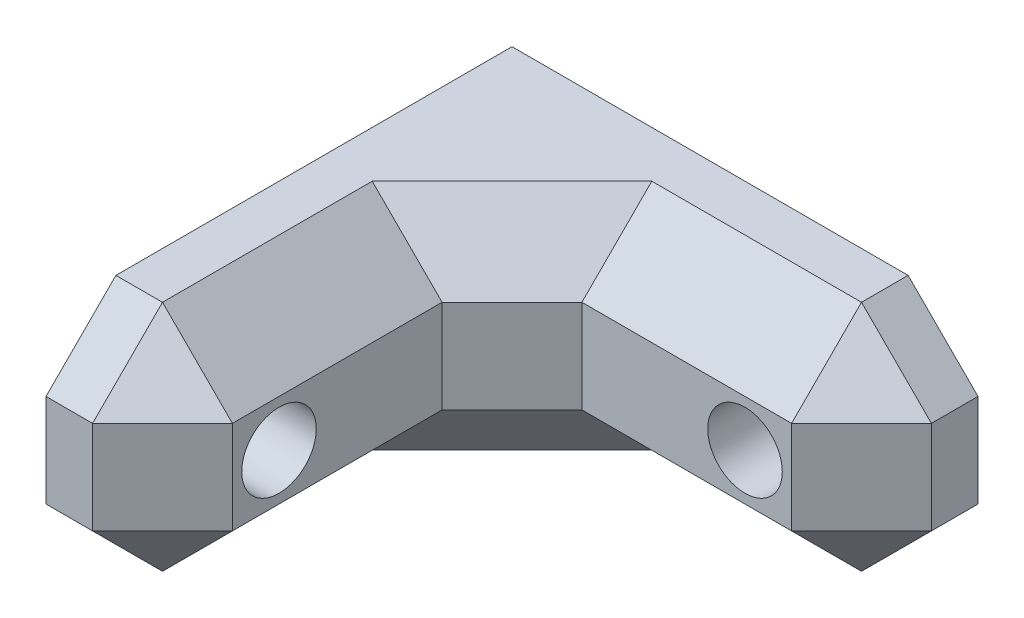
ISO-10303-21;
HEADER;
FILE_DESCRIPTION(('STEP AP214'),'2;1');
FILE_NAME('part.step','',(''),(''),'','','');
FILE_SCHEMA(('AUTOMOTIVE_DESIGN { 1 0 10303 214 1 1 1 1 }'));
ENDSEC;
DATA;
#1=APPLICATION_CONTEXT('core data for automotive mechanical design processes');
#2=APPLICATION_PROTOCOL_DEFINITION('international standard','automotive_design',2000,#1);
#3=PRODUCT_CONTEXT('',#1,'mechanical');
#4=PRODUCT('Part','Part','',(#3));
#5=PRODUCT_RELATED_PRODUCT_CATEGORY('part','',(#4));
#6=PRODUCT_DEFINITION_FORMATION('','',#4);
#7=PRODUCT_DEFINITION_CONTEXT('part definition',#1,'design');
#8=PRODUCT_DEFINITION('design','',#6,#7);
#9=PRODUCT_DEFINITION_SHAPE('','',#8);
#10=(LENGTH_UNIT() NAMED_UNIT(*) SI_UNIT(.MILLI.,.METRE.));
#11=(NAMED_UNIT(*) PLANE_ANGLE_UNIT() SI_UNIT($,.RADIAN.));
#12=(NAMED_UNIT(*) SI_UNIT($,.STERADIAN.) SOLID_ANGLE_UNIT());
#13=UNCERTAINTY_MEASURE_WITH_UNIT(LENGTH_MEASURE(1.E-05),#10,'distance_accuracy_value','');
#14=(GEOMETRIC_REPRESENTATION_CONTEXT(3) GLOBAL_UNCERTAINTY_ASSIGNED_CONTEXT((#13)) GLOBAL_UNIT_ASSIGNED_CONTEXT((#10,
#11,#12)) REPRESENTATION_CONTEXT('',''));
#15=CARTESIAN_POINT('',(0.,0.,0.));
#16=DIRECTION('',(0.,0.,1.));
#17=DIRECTION('',(1.,0.,0.));
#18=AXIS2_PLACEMENT_3D('',#15,#16,#17);
#19=CARTESIAN_POINT('',(0.,0.,5.));
#20=DIRECTION('',(0.,1.,0.));
#21=DIRECTION('',(0.,0.,1.));
#22=AXIS2_PLACEMENT_3D('',#19,#20,#21);
#23=PLANE('',#22);
#24=DIRECTION('',(1.,0.,0.));
#25=VECTOR('',#24,1.);
#26=CARTESIAN_POINT('',(0.,0.,0.));
#27=LINE('',#26,#25);
#28=CARTESIAN_POINT('',(0.,0.,0.));
#29=VERTEX_POINT('',#28);
#30=CARTESIAN_POINT('',(17.,0.,0.));
#31=VERTEX_POINT('',#30);
#32=EDGE_CURVE('E174',#29,#31,#27,.T.);
#33=ORIENTED_EDGE('',*,*,#32,.T.);
#34=DIRECTION('',(0.,0.,1.));
#35=VECTOR('',#34,1.);
#36=CARTESIAN_POINT('',(17.,0.,5.));
#37=LINE('',#36,#35);
#38=CARTESIAN_POINT('',(17.,0.,1.99999999999999));
#39=VERTEX_POINT('',#38);
#40=EDGE_CURVE('E253',#31,#39,#37,.T.);
#41=ORIENTED_EDGE('',*,*,#40,.T.);
#42=DIRECTION('',(-1.,0.,0.));
#43=VECTOR('',#42,1.);
#44=CARTESIAN_POINT('',(5.,0.,1.99999999999999));
#45=LINE('',#44,#43);
#46=CARTESIAN_POINT('',(8.,0.,1.99999999999999));
#47=VERTEX_POINT('',#46);
#48=EDGE_CURVE('E245',#39,#47,#45,.T.);
#49=ORIENTED_EDGE('',*,*,#48,.T.);
#50=DIRECTION('',(0.707106781186546,0.,-0.707106781186549));
#51=VECTOR('',#50,1.);
#52=CARTESIAN_POINT('',(8.,0.,1.99999999999999));
#53=LINE('',#52,#51);
#54=CARTESIAN_POINT('',(5.,0.,5.));
#55=VERTEX_POINT('',#54);
#56=EDGE_CURVE('E237',#55,#47,#53,.T.);
#57=ORIENTED_EDGE('',*,*,#56,.F.);
#58=DIRECTION('',(0.707106781186546,0.,-0.707106781186549));
#59=VECTOR('',#58,1.);
#60=CARTESIAN_POINT('',(8.,0.,1.99999999999999));
#61=LINE('',#60,#59);
#62=CARTESIAN_POINT('',(1.99999999999999,0.,8.00000000000001));
#63=VERTEX_POINT('',#62);
#64=EDGE_CURVE('E240',#63,#55,#61,.T.);
#65=ORIENTED_EDGE('',*,*,#64,.F.);
#66=DIRECTION('',(0.,0.,1.));
#67=VECTOR('',#66,1.);
#68=CARTESIAN_POINT('',(1.99999999999999,0.,20.));
#69=LINE('',#68,#67);
#70=CARTESIAN_POINT('',(1.99999999999999,0.,17.));
#71=VERTEX_POINT('',#70);
#72=EDGE_CURVE('E249',#63,#71,#69,.T.);
#73=ORIENTED_EDGE('',*,*,#72,.T.);
#74=DIRECTION('',(-1.,0.,0.));
#75=VECTOR('',#74,1.);
#76=CARTESIAN_POINT('',(0.,0.,17.));
#77=LINE('',#76,#75);
#78=CARTESIAN_POINT('',(0.,0.,17.));
#79=VERTEX_POINT('',#78);
#80=EDGE_CURVE('E251',#71,#79,#77,.T.);
#81=ORIENTED_EDGE('',*,*,#80,.T.);
#82=DIRECTION('',(0.,0.,-1.));
#83=VECTOR('',#82,1.);
#84=CARTESIAN_POINT('',(0.,0.,20.));
#85=LINE('',#84,#83);
#86=EDGE_CURVE('E159',#79,#29,#85,.T.);
#87=ORIENTED_EDGE('',*,*,#86,.T.);
#88=EDGE_LOOP('',(#33,#41,#49,#57,#65,#73,#81,#87));
#89=FACE_BOUND('',#88,.T.);
#90=ADVANCED_FACE('F35',(#89),#23,.F.);
#91=CARTESIAN_POINT('',(20.,0.,5.));
#92=DIRECTION('',(-1.,0.,0.));
#93=DIRECTION('',(0.,0.,1.));
#94=AXIS2_PLACEMENT_3D('',#91,#92,#93);
#95=PLANE('',#94);
#96=DIRECTION('',(0.,1.,0.));
#97=VECTOR('',#96,1.);
#98=CARTESIAN_POINT('',(20.,0.,0.));
#99=LINE('',#98,#97);
#100=CARTESIAN_POINT('',(20.,3.00000000000001,0.));
#101=VERTEX_POINT('',#100);
#102=CARTESIAN_POINT('',(20.,6.99999999999999,0.));
#103=VERTEX_POINT('',#102);
#104=EDGE_CURVE('E169',#101,#103,#99,.T.);
#105=ORIENTED_EDGE('',*,*,#104,.T.);
#106=DIRECTION('',(0.,0.,1.));
#107=VECTOR('',#106,1.);
#108=CARTESIAN_POINT('',(20.,6.99999999999999,5.));
#109=LINE('',#108,#107);
#110=CARTESIAN_POINT('',(20.,6.99999999999999,1.99999999999999));
#111=VERTEX_POINT('',#110);
#112=EDGE_CURVE('E235',#103,#111,#109,.T.);
#113=ORIENTED_EDGE('',*,*,#112,.T.);
#114=DIRECTION('',(0.,-1.,0.));
#115=VECTOR('',#114,1.);
#116=CARTESIAN_POINT('',(20.,0.,1.99999999999999));
#117=LINE('',#116,#115);
#118=CARTESIAN_POINT('',(20.,3.00000000000001,1.99999999999999));
#119=VERTEX_POINT('',#118);
#120=EDGE_CURVE('E231',#111,#119,#117,.T.);
#121=ORIENTED_EDGE('',*,*,#120,.T.);
#122=DIRECTION('',(0.,0.,-1.));
#123=VECTOR('',#122,1.);
#124=CARTESIAN_POINT('',(20.,3.00000000000001,5.));
#125=LINE('',#124,#123);
#126=EDGE_CURVE('E233',#119,#101,#125,.T.);
#127=ORIENTED_EDGE('',*,*,#126,.T.);
#128=EDGE_LOOP('',(#105,#113,#121,#127));
#129=FACE_BOUND('',#128,.T.);
#130=ADVANCED_FACE('F333',(#129),#95,.F.);
#131=CARTESIAN_POINT('',(0.,10.,5.));
#132=DIRECTION('',(0.,1.,0.));
#133=DIRECTION('',(0.,0.,1.));
#134=AXIS2_PLACEMENT_3D('',#131,#132,#133);
#135=PLANE('',#134);
#136=DIRECTION('',(0.,0.,-1.));
#137=VECTOR('',#136,1.);
#138=CARTESIAN_POINT('',(0.,10.,20.));
#139=LINE('',#138,#137);
#140=CARTESIAN_POINT('',(0.,10.,17.));
#141=VERTEX_POINT('',#140);
#142=CARTESIAN_POINT('',(0.,10.,0.));
#143=VERTEX_POINT('',#142);
#144=EDGE_CURVE('E148',#141,#143,#139,.T.);
#145=ORIENTED_EDGE('',*,*,#144,.F.);
#146=DIRECTION('',(1.,0.,0.));
#147=VECTOR('',#146,1.);
#148=CARTESIAN_POINT('',(0.,10.,17.));
#149=LINE('',#148,#147);
#150=CARTESIAN_POINT('',(2.,10.,17.));
#151=VERTEX_POINT('',#150);
#152=EDGE_CURVE('E225',#141,#151,#149,.T.);
#153=ORIENTED_EDGE('',*,*,#152,.T.);
#154=DIRECTION('',(0.,0.,-1.));
#155=VECTOR('',#154,1.);
#156=CARTESIAN_POINT('',(2.,10.,5.));
#157=LINE('',#156,#155);
#158=CARTESIAN_POINT('',(2.,10.,8.00000000000001));
#159=VERTEX_POINT('',#158);
#160=EDGE_CURVE('E221',#151,#159,#157,.T.);
#161=ORIENTED_EDGE('',*,*,#160,.T.);
#162=DIRECTION('',(-0.707106781186546,0.,0.707106781186549));
#163=VECTOR('',#162,1.);
#164=CARTESIAN_POINT('',(2.50000000000001,10.,7.5));
#165=LINE('',#164,#163);
#166=CARTESIAN_POINT('',(5.,10.,5.));
#167=VERTEX_POINT('',#166);
#168=EDGE_CURVE('E218',#167,#159,#165,.T.);
#169=ORIENTED_EDGE('',*,*,#168,.F.);
#170=DIRECTION('',(-0.707106781186546,0.,0.707106781186549));
#171=VECTOR('',#170,1.);
#172=CARTESIAN_POINT('',(2.50000000000001,10.,7.5));
#173=LINE('',#172,#171);
#174=CARTESIAN_POINT('',(8.,10.,1.99999999999999));
#175=VERTEX_POINT('',#174);
#176=EDGE_CURVE('E212',#175,#167,#173,.T.);
#177=ORIENTED_EDGE('',*,*,#176,.F.);
#178=DIRECTION('',(1.,0.,0.));
#179=VECTOR('',#178,1.);
#180=CARTESIAN_POINT('',(0.,10.,1.99999999999999));
#181=LINE('',#180,#179);
#182=CARTESIAN_POINT('',(17.,10.,1.99999999999999));
#183=VERTEX_POINT('',#182);
#184=EDGE_CURVE('E210',#175,#183,#181,.T.);
#185=ORIENTED_EDGE('',*,*,#184,.T.);
#186=DIRECTION('',(0.,0.,-1.));
#187=VECTOR('',#186,1.);
#188=CARTESIAN_POINT('',(17.,10.,0.));
#189=LINE('',#188,#187);
#190=CARTESIAN_POINT('',(17.,10.,0.));
#191=VERTEX_POINT('',#190);
#192=EDGE_CURVE('E166',#183,#191,#189,.T.);
#193=ORIENTED_EDGE('',*,*,#192,.T.);
#194=DIRECTION('',(1.,0.,0.));
#195=VECTOR('',#194,1.);
#196=CARTESIAN_POINT('',(0.,10.,0.));
#197=LINE('',#196,#195);
#198=EDGE_CURVE('E163',#143,#191,#197,.T.);
#199=ORIENTED_EDGE('',*,*,#198,.F.);
#200=EDGE_LOOP('',(#145,#153,#161,#169,#177,#185,#193,#199));
#201=FACE_BOUND('',#200,.T.);
#202=ADVANCED_FACE('F164',(#201),#135,.T.);
#203=CARTESIAN_POINT('',(15.,5.,5.));
#204=DIRECTION('',(0.,0.,-1.));
#205=DIRECTION('',(-1.,0.,0.));
#206=AXIS2_PLACEMENT_3D('',#203,#204,#205);
#207=CYLINDRICAL_SURFACE('',#206,1.6);
#208=CARTESIAN_POINT('',(15.,5.,5.));
#209=DIRECTION('',(0.,0.,1.));
#210=DIRECTION('',(1.,0.,0.));
#211=AXIS2_PLACEMENT_3D('',#208,#209,#210);
#212=CIRCLE('',#211,1.6);
#213=CARTESIAN_POINT('',(16.6,5.,5.));
#214=VERTEX_POINT('',#213);
#215=EDGE_CURVE('E168',#214,#214,#212,.T.);
#216=ORIENTED_EDGE('',*,*,#215,.T.);
#217=EDGE_LOOP('',(#216));
#218=FACE_BOUND('',#217,.T.);
#219=CARTESIAN_POINT('',(15.,5.,0.));
#220=DIRECTION('',(0.,0.,1.));
#221=DIRECTION('',(1.,0.,0.));
#222=AXIS2_PLACEMENT_3D('',#219,#220,#221);
#223=CIRCLE('',#222,1.6);
#224=CARTESIAN_POINT('',(16.6,5.,0.));
#225=VERTEX_POINT('',#224);
#226=EDGE_CURVE('E158',#225,#225,#223,.T.);
#227=ORIENTED_EDGE('',*,*,#226,.F.);
#228=EDGE_LOOP('',(#227));
#229=FACE_BOUND('',#228,.T.);
#230=ADVANCED_FACE('F343',(#218,#229),#207,.F.);
#231=CARTESIAN_POINT('',(0.,0.,5.));
#232=DIRECTION('',(0.,0.,1.));
#233=DIRECTION('',(1.,0.,0.));
#234=AXIS2_PLACEMENT_3D('',#231,#232,#233);
#235=PLANE('',#234);
#236=DIRECTION('',(-1.,0.,0.));
#237=VECTOR('',#236,1.);
#238=CARTESIAN_POINT('',(0.,7.00000000000001,5.));
#239=LINE('',#238,#237);
#240=CARTESIAN_POINT('',(17.,7.00000000000001,5.));
#241=VERTEX_POINT('',#240);
#242=CARTESIAN_POINT('',(8.,7.00000000000001,5.));
#243=VERTEX_POINT('',#242);
#244=EDGE_CURVE('E196',#241,#243,#239,.T.);
#245=ORIENTED_EDGE('',*,*,#244,.T.);
#246=DIRECTION('',(0.,-1.,0.));
#247=VECTOR('',#246,1.);
#248=CARTESIAN_POINT('',(8.,0.,5.));
#249=LINE('',#248,#247);
#250=CARTESIAN_POINT('',(8.,3.,5.));
#251=VERTEX_POINT('',#250);
#252=EDGE_CURVE('E198',#243,#251,#249,.T.);
#253=ORIENTED_EDGE('',*,*,#252,.T.);
#254=DIRECTION('',(1.,0.,0.));
#255=VECTOR('',#254,1.);
#256=CARTESIAN_POINT('',(20.,3.,5.));
#257=LINE('',#256,#255);
#258=CARTESIAN_POINT('',(17.,3.,5.));
#259=VERTEX_POINT('',#258);
#260=EDGE_CURVE('E194',#251,#259,#257,.T.);
#261=ORIENTED_EDGE('',*,*,#260,.T.);
#262=DIRECTION('',(0.,1.,0.));
#263=VECTOR('',#262,1.);
#264=CARTESIAN_POINT('',(17.,10.,5.));
#265=LINE('',#264,#263);
#266=EDGE_CURVE('E187',#259,#241,#265,.T.);
#267=ORIENTED_EDGE('',*,*,#266,.T.);
#268=EDGE_LOOP('',(#245,#253,#261,#267));
#269=FACE_BOUND('',#268,.T.);
#270=ORIENTED_EDGE('',*,*,#215,.F.);
#271=EDGE_LOOP('',(#270));
#272=FACE_BOUND('',#271,.T.);
#273=ADVANCED_FACE('F328',(#269,#272),#235,.T.);
#274=CARTESIAN_POINT('',(0.,0.,0.));
#275=DIRECTION('',(0.,0.,1.));
#276=DIRECTION('',(1.,0.,0.));
#277=AXIS2_PLACEMENT_3D('',#274,#275,#276);
#278=PLANE('',#277);
#279=ORIENTED_EDGE('',*,*,#226,.T.);
#280=EDGE_LOOP('',(#279));
#281=FACE_BOUND('',#280,.T.);
#282=ORIENTED_EDGE('',*,*,#198,.T.);
#283=DIRECTION('',(0.707106781186546,-0.707106781186549,0.));
#284=VECTOR('',#283,1.);
#285=CARTESIAN_POINT('',(17.,10.,0.));
#286=LINE('',#285,#284);
#287=EDGE_CURVE('E229',#191,#103,#286,.T.);
#288=ORIENTED_EDGE('',*,*,#287,.T.);
#289=ORIENTED_EDGE('',*,*,#104,.F.);
#290=DIRECTION('',(0.707106781186546,0.707106781186549,0.));
#291=VECTOR('',#290,1.);
#292=CARTESIAN_POINT('',(20.,3.00000000000001,0.));
#293=LINE('',#292,#291);
#294=EDGE_CURVE('E227',#101,#31,#293,.F.);
#295=ORIENTED_EDGE('',*,*,#294,.T.);
#296=ORIENTED_EDGE('',*,*,#32,.F.);
#297=DIRECTION('',(0.,1.,0.));
#298=VECTOR('',#297,1.);
#299=CARTESIAN_POINT('',(0.,0.,0.));
#300=LINE('',#299,#298);
#301=EDGE_CURVE('E153',#29,#143,#300,.T.);
#302=ORIENTED_EDGE('',*,*,#301,.T.);
#303=EDGE_LOOP('',(#282,#288,#289,#295,#296,#302));
#304=FACE_BOUND('',#303,.T.);
#305=ADVANCED_FACE('F172',(#281,#304),#278,.F.);
#306=CARTESIAN_POINT('',(5.,0.,20.));
#307=DIRECTION('',(1.,0.,0.));
#308=DIRECTION('',(0.,1.,0.));
#309=AXIS2_PLACEMENT_3D('',#306,#307,#308);
#310=PLANE('',#309);
#311=DIRECTION('',(0.,0.,-1.));
#312=VECTOR('',#311,1.);
#313=CARTESIAN_POINT('',(5.,3.,5.));
#314=LINE('',#313,#312);
#315=CARTESIAN_POINT('',(5.,3.,17.));
#316=VERTEX_POINT('',#315);
#317=CARTESIAN_POINT('',(5.,3.,8.00000000000001));
#318=VERTEX_POINT('',#317);
#319=EDGE_CURVE('E201',#316,#318,#314,.T.);
#320=ORIENTED_EDGE('',*,*,#319,.T.);
#321=DIRECTION('',(0.,1.,0.));
#322=VECTOR('',#321,1.);
#323=CARTESIAN_POINT('',(5.,10.,8.00000000000001));
#324=LINE('',#323,#322);
#325=CARTESIAN_POINT('',(5.,6.99999999999999,8.00000000000001));
#326=VERTEX_POINT('',#325);
#327=EDGE_CURVE('E207',#318,#326,#324,.T.);
#328=ORIENTED_EDGE('',*,*,#327,.T.);
#329=DIRECTION('',(0.,0.,1.));
#330=VECTOR('',#329,1.);
#331=CARTESIAN_POINT('',(5.,6.99999999999999,20.));
#332=LINE('',#331,#330);
#333=CARTESIAN_POINT('',(5.,6.99999999999999,17.));
#334=VERTEX_POINT('',#333);
#335=EDGE_CURVE('E205',#326,#334,#332,.T.);
#336=ORIENTED_EDGE('',*,*,#335,.T.);
#337=DIRECTION('',(0.,-1.,0.));
#338=VECTOR('',#337,1.);
#339=CARTESIAN_POINT('',(5.,0.,17.));
#340=LINE('',#339,#338);
#341=EDGE_CURVE('E203',#334,#316,#340,.T.);
#342=ORIENTED_EDGE('',*,*,#341,.T.);
#343=EDGE_LOOP('',(#320,#328,#336,#342));
#344=FACE_BOUND('',#343,.T.);
#345=CARTESIAN_POINT('',(5.,5.,15.));
#346=DIRECTION('',(1.,0.,0.));
#347=DIRECTION('',(0.,1.,0.));
#348=AXIS2_PLACEMENT_3D('',#345,#346,#347);
#349=CIRCLE('',#348,1.6);
#350=CARTESIAN_POINT('',(5.,6.6,15.));
#351=VERTEX_POINT('',#350);
#352=EDGE_CURVE('E180',#351,#351,#349,.T.);
#353=ORIENTED_EDGE('',*,*,#352,.F.);
#354=EDGE_LOOP('',(#353));
#355=FACE_BOUND('',#354,.T.);
#356=ADVANCED_FACE('F317',(#344,#355),#310,.T.);
#357=CARTESIAN_POINT('',(0.,0.,20.));
#358=DIRECTION('',(-1.,0.,0.));
#359=DIRECTION('',(0.,0.,1.));
#360=AXIS2_PLACEMENT_3D('',#357,#358,#359);
#361=PLANE('',#360);
#362=CARTESIAN_POINT('',(0.,5.,15.));
#363=DIRECTION('',(-1.,0.,0.));
#364=DIRECTION('',(0.,0.,1.));
#365=AXIS2_PLACEMENT_3D('',#362,#363,#364);
#366=CIRCLE('',#365,1.6);
#367=CARTESIAN_POINT('',(0.,5.,16.6));
#368=VERTEX_POINT('',#367);
#369=EDGE_CURVE('E176',#368,#368,#366,.T.);
#370=ORIENTED_EDGE('',*,*,#369,.F.);
#371=EDGE_LOOP('',(#370));
#372=FACE_BOUND('',#371,.T.);
#373=ORIENTED_EDGE('',*,*,#86,.F.);
#374=DIRECTION('',(0.,0.707106781186546,0.707106781186549));
#375=VECTOR('',#374,1.);
#376=CARTESIAN_POINT('',(0.,1.5,18.5));
#377=LINE('',#376,#375);
#378=CARTESIAN_POINT('',(0.,3.,20.));
#379=VERTEX_POINT('',#378);
#380=EDGE_CURVE('E11',#79,#379,#377,.T.);
#381=ORIENTED_EDGE('',*,*,#380,.T.);
#382=DIRECTION('',(0.,1.,0.));
#383=VECTOR('',#382,1.);
#384=CARTESIAN_POINT('',(0.,0.,20.));
#385=LINE('',#384,#383);
#386=CARTESIAN_POINT('',(0.,6.99999999999999,20.));
#387=VERTEX_POINT('',#386);
#388=EDGE_CURVE('E175',#379,#387,#385,.T.);
#389=ORIENTED_EDGE('',*,*,#388,.T.);
#390=DIRECTION('',(0.,-0.707106781186549,0.707106781186546));
#391=VECTOR('',#390,1.);
#392=CARTESIAN_POINT('',(0.,3.49999999999998,23.5));
#393=LINE('',#392,#391);
#394=EDGE_CURVE('E44',#387,#141,#393,.F.);
#395=ORIENTED_EDGE('',*,*,#394,.T.);
#396=ORIENTED_EDGE('',*,*,#144,.T.);
#397=ORIENTED_EDGE('',*,*,#301,.F.);
#398=EDGE_LOOP('',(#373,#381,#389,#395,#396,#397));
#399=FACE_BOUND('',#398,.T.);
#400=ADVANCED_FACE('F151',(#372,#399),#361,.T.);
#401=CARTESIAN_POINT('',(0.,0.,20.));
#402=DIRECTION('',(0.,0.,1.));
#403=DIRECTION('',(1.,0.,0.));
#404=AXIS2_PLACEMENT_3D('',#401,#402,#403);
#405=PLANE('',#404);
#406=ORIENTED_EDGE('',*,*,#388,.F.);
#407=DIRECTION('',(1.,0.,0.));
#408=VECTOR('',#407,1.);
#409=CARTESIAN_POINT('',(5.,3.,20.));
#410=LINE('',#409,#408);
#411=CARTESIAN_POINT('',(1.99999999999999,3.,20.));
#412=VERTEX_POINT('',#411);
#413=EDGE_CURVE('E57',#379,#412,#410,.T.);
#414=ORIENTED_EDGE('',*,*,#413,.T.);
#415=DIRECTION('',(0.,1.,0.));
#416=VECTOR('',#415,1.);
#417=CARTESIAN_POINT('',(1.99999999999999,0.,20.));
#418=LINE('',#417,#416);
#419=CARTESIAN_POINT('',(1.99999999999999,6.99999999999999,20.));
#420=VERTEX_POINT('',#419);
#421=EDGE_CURVE('E52',#412,#420,#418,.T.);
#422=ORIENTED_EDGE('',*,*,#421,.T.);
#423=DIRECTION('',(-1.,0.,0.));
#424=VECTOR('',#423,1.);
#425=CARTESIAN_POINT('',(0.,6.99999999999999,20.));
#426=LINE('',#425,#424);
#427=EDGE_CURVE('E256',#420,#387,#426,.T.);
#428=ORIENTED_EDGE('',*,*,#427,.T.);
#429=EDGE_LOOP('',(#406,#414,#422,#428));
#430=FACE_BOUND('',#429,.T.);
#431=ADVANCED_FACE('F325',(#430),#405,.T.);
#432=CARTESIAN_POINT('',(-15.,5.,15.));
#433=DIRECTION('',(1.,0.,0.));
#434=DIRECTION('',(0.,1.,0.));
#435=AXIS2_PLACEMENT_3D('',#432,#433,#434);
#436=CYLINDRICAL_SURFACE('',#435,1.6);
#437=ORIENTED_EDGE('',*,*,#369,.T.);
#438=EDGE_LOOP('',(#437));
#439=FACE_BOUND('',#438,.T.);
#440=ORIENTED_EDGE('',*,*,#352,.T.);
#441=EDGE_LOOP('',(#440));
#442=FACE_BOUND('',#441,.T.);
#443=ADVANCED_FACE('F315',(#439,#442),#436,.F.);
#444=CARTESIAN_POINT('',(0.,10.,17.));
#445=DIRECTION('',(0.,-0.707106781186546,-0.707106781186549));
#446=DIRECTION('',(1.,0.,0.));
#447=AXIS2_PLACEMENT_3D('',#444,#445,#446);
#448=PLANE('',#447);
#449=ORIENTED_EDGE('',*,*,#394,.F.);
#450=ORIENTED_EDGE('',*,*,#427,.F.);
#451=DIRECTION('',(0.,0.707106781186549,-0.707106781186546));
#452=VECTOR('',#451,1.);
#453=CARTESIAN_POINT('',(2.,10.,17.));
#454=LINE('',#453,#452);
#455=EDGE_CURVE('E305',#151,#420,#454,.F.);
#456=ORIENTED_EDGE('',*,*,#455,.F.);
#457=ORIENTED_EDGE('',*,*,#152,.F.);
#458=EDGE_LOOP('',(#449,#450,#456,#457));
#459=FACE_BOUND('',#458,.T.);
#460=ADVANCED_FACE('F37',(#459),#448,.F.);
#461=CARTESIAN_POINT('',(17.,10.,5.));
#462=DIRECTION('',(0.707106781186549,0.707106781186546,0.));
#463=DIRECTION('',(0.,0.,1.));
#464=AXIS2_PLACEMENT_3D('',#461,#462,#463);
#465=PLANE('',#464);
#466=ORIENTED_EDGE('',*,*,#287,.F.);
#467=ORIENTED_EDGE('',*,*,#192,.F.);
#468=DIRECTION('',(-0.707106781186546,0.707106781186549,0.));
#469=VECTOR('',#468,1.);
#470=CARTESIAN_POINT('',(20.,6.99999999999999,1.99999999999999));
#471=LINE('',#470,#469);
#472=EDGE_CURVE('E303',#111,#183,#471,.T.);
#473=ORIENTED_EDGE('',*,*,#472,.F.);
#474=ORIENTED_EDGE('',*,*,#112,.F.);
#475=EDGE_LOOP('',(#466,#467,#473,#474));
#476=FACE_BOUND('',#475,.T.);
#477=ADVANCED_FACE('F404',(#476),#465,.T.);
#478=CARTESIAN_POINT('',(17.,0.,5.));
#479=DIRECTION('',(0.707106781186549,0.,0.707106781186546));
#480=DIRECTION('',(0.,-1.,0.));
#481=AXIS2_PLACEMENT_3D('',#478,#479,#480);
#482=PLANE('',#481);
#483=DIRECTION('',(-0.707106781186546,0.,0.707106781186549));
#484=VECTOR('',#483,1.);
#485=CARTESIAN_POINT('',(18.5,3.,3.5));
#486=LINE('',#485,#484);
#487=EDGE_CURVE('E297',#119,#259,#486,.T.);
#488=ORIENTED_EDGE('',*,*,#487,.F.);
#489=ORIENTED_EDGE('',*,*,#120,.F.);
#490=DIRECTION('',(0.707106781186546,0.,-0.707106781186549));
#491=VECTOR('',#490,1.);
#492=CARTESIAN_POINT('',(20.,6.99999999999999,1.99999999999999));
#493=LINE('',#492,#491);
#494=EDGE_CURVE('E300',#241,#111,#493,.T.);
#495=ORIENTED_EDGE('',*,*,#494,.F.);
#496=ORIENTED_EDGE('',*,*,#266,.F.);
#497=EDGE_LOOP('',(#488,#489,#495,#496));
#498=FACE_BOUND('',#497,.T.);
#499=ADVANCED_FACE('F401',(#498),#482,.T.);
#500=CARTESIAN_POINT('',(20.,3.00000000000001,5.));
#501=DIRECTION('',(-0.707106781186549,0.707106781186546,0.));
#502=DIRECTION('',(0.,0.,-1.));
#503=AXIS2_PLACEMENT_3D('',#500,#501,#502);
#504=PLANE('',#503);
#505=ORIENTED_EDGE('',*,*,#294,.F.);
#506=ORIENTED_EDGE('',*,*,#126,.F.);
#507=DIRECTION('',(-0.707106781186546,-0.707106781186549,0.));
#508=VECTOR('',#507,1.);
#509=CARTESIAN_POINT('',(17.,0.,1.99999999999999));
#510=LINE('',#509,#508);
#511=EDGE_CURVE('E294',#39,#119,#510,.F.);
#512=ORIENTED_EDGE('',*,*,#511,.F.);
#513=ORIENTED_EDGE('',*,*,#40,.F.);
#514=EDGE_LOOP('',(#505,#506,#512,#513));
#515=FACE_BOUND('',#514,.T.);
#516=ADVANCED_FACE('F397',(#515),#504,.F.);
#517=CARTESIAN_POINT('',(0.,3.,20.));
#518=DIRECTION('',(0.,-0.707106781186549,0.707106781186546));
#519=DIRECTION('',(-1.,0.,0.));
#520=AXIS2_PLACEMENT_3D('',#517,#518,#519);
#521=PLANE('',#520);
#522=ORIENTED_EDGE('',*,*,#380,.F.);
#523=ORIENTED_EDGE('',*,*,#80,.F.);
#524=DIRECTION('',(0.,-0.707106781186546,-0.707106781186549));
#525=VECTOR('',#524,1.);
#526=CARTESIAN_POINT('',(1.99999999999999,3.,20.));
#527=LINE('',#526,#525);
#528=EDGE_CURVE('E291',#412,#71,#527,.T.);
#529=ORIENTED_EDGE('',*,*,#528,.F.);
#530=ORIENTED_EDGE('',*,*,#413,.F.);
#531=EDGE_LOOP('',(#522,#523,#529,#530));
#532=FACE_BOUND('',#531,.T.);
#533=ADVANCED_FACE('F393',(#532),#521,.T.);
#534=CARTESIAN_POINT('',(5.,0.,17.));
#535=DIRECTION('',(-0.707106781186546,0.,-0.707106781186549));
#536=DIRECTION('',(0.,-1.,0.));
#537=AXIS2_PLACEMENT_3D('',#534,#535,#536);
#538=PLANE('',#537);
#539=DIRECTION('',(-0.707106781186549,0.,0.707106781186546));
#540=VECTOR('',#539,1.);
#541=CARTESIAN_POINT('',(3.5,6.99999999999999,18.5));
#542=LINE('',#541,#540);
#543=EDGE_CURVE('E39',#420,#334,#542,.F.);
#544=ORIENTED_EDGE('',*,*,#543,.F.);
#545=ORIENTED_EDGE('',*,*,#421,.F.);
#546=DIRECTION('',(0.707106781186549,0.,-0.707106781186546));
#547=VECTOR('',#546,1.);
#548=CARTESIAN_POINT('',(1.99999999999999,3.,20.));
#549=LINE('',#548,#547);
#550=EDGE_CURVE('E288',#316,#412,#549,.F.);
#551=ORIENTED_EDGE('',*,*,#550,.F.);
#552=ORIENTED_EDGE('',*,*,#341,.F.);
#553=EDGE_LOOP('',(#544,#545,#551,#552));
#554=FACE_BOUND('',#553,.T.);
#555=ADVANCED_FACE('F390',(#554),#538,.F.);
#556=CARTESIAN_POINT('',(2.,10.,17.));
#557=DIRECTION('',(0.577350269189626,0.577350269189624,0.577350269189628));
#558=DIRECTION('',(0.707106781186549,0.,-0.707106781186546));
#559=AXIS2_PLACEMENT_3D('',#556,#557,#558);
#560=PLANE('',#559);
#561=ORIENTED_EDGE('',*,*,#455,.T.);
#562=ORIENTED_EDGE('',*,*,#543,.T.);
#563=DIRECTION('',(0.707106781186546,-0.707106781186549,0.));
#564=VECTOR('',#563,1.);
#565=CARTESIAN_POINT('',(2.,10.,17.));
#566=LINE('',#565,#564);
#567=EDGE_CURVE('E285',#151,#334,#566,.T.);
#568=ORIENTED_EDGE('',*,*,#567,.F.);
#569=EDGE_LOOP('',(#561,#562,#568));
#570=FACE_BOUND('',#569,.T.);
#571=ADVANCED_FACE('F386',(#570),#560,.T.);
#572=CARTESIAN_POINT('',(20.,6.99999999999999,1.99999999999999));
#573=DIRECTION('',(0.577350269189628,0.577350269189626,0.577350269189624));
#574=DIRECTION('',(-0.707106781186546,0.707106781186549,0.));
#575=AXIS2_PLACEMENT_3D('',#572,#573,#574);
#576=PLANE('',#575);
#577=ORIENTED_EDGE('',*,*,#494,.T.);
#578=ORIENTED_EDGE('',*,*,#472,.T.);
#579=DIRECTION('',(0.,0.707106781186546,-0.707106781186549));
#580=VECTOR('',#579,1.);
#581=CARTESIAN_POINT('',(17.,8.5,3.5));
#582=LINE('',#581,#580);
#583=EDGE_CURVE('E282',#241,#183,#582,.T.);
#584=ORIENTED_EDGE('',*,*,#583,.F.);
#585=EDGE_LOOP('',(#577,#578,#584));
#586=FACE_BOUND('',#585,.T.);
#587=ADVANCED_FACE('F382',(#586),#576,.T.);
#588=CARTESIAN_POINT('',(17.,0.,1.99999999999999));
#589=DIRECTION('',(0.577350269189628,-0.577350269189626,0.577350269189624));
#590=DIRECTION('',(0.707106781186546,0.707106781186549,0.));
#591=AXIS2_PLACEMENT_3D('',#588,#589,#590);
#592=PLANE('',#591);
#593=ORIENTED_EDGE('',*,*,#511,.T.);
#594=ORIENTED_EDGE('',*,*,#487,.T.);
#595=DIRECTION('',(0.,-0.707106781186546,-0.707106781186549));
#596=VECTOR('',#595,1.);
#597=CARTESIAN_POINT('',(17.,0.,1.99999999999999));
#598=LINE('',#597,#596);
#599=EDGE_CURVE('E279',#39,#259,#598,.F.);
#600=ORIENTED_EDGE('',*,*,#599,.F.);
#601=EDGE_LOOP('',(#593,#594,#600));
#602=FACE_BOUND('',#601,.T.);
#603=ADVANCED_FACE('F378',(#602),#592,.T.);
#604=CARTESIAN_POINT('',(1.99999999999999,3.,20.));
#605=DIRECTION('',(0.577350269189624,-0.577350269189628,0.577350269189626));
#606=DIRECTION('',(0.,-0.707106781186546,-0.707106781186549));
#607=AXIS2_PLACEMENT_3D('',#604,#605,#606);
#608=PLANE('',#607);
#609=ORIENTED_EDGE('',*,*,#550,.T.);
#610=ORIENTED_EDGE('',*,*,#528,.T.);
#611=DIRECTION('',(0.707106781186549,0.707106781186546,0.));
#612=VECTOR('',#611,1.);
#613=CARTESIAN_POINT('',(3.5,1.5,17.));
#614=LINE('',#613,#612);
#615=EDGE_CURVE('E276',#316,#71,#614,.F.);
#616=ORIENTED_EDGE('',*,*,#615,.F.);
#617=EDGE_LOOP('',(#609,#610,#616));
#618=FACE_BOUND('',#617,.T.);
#619=ADVANCED_FACE('F374',(#618),#608,.T.);
#620=CARTESIAN_POINT('',(2.,10.,5.));
#621=DIRECTION('',(-0.707106781186549,-0.707106781186546,0.));
#622=DIRECTION('',(0.,0.,-1.));
#623=AXIS2_PLACEMENT_3D('',#620,#621,#622);
#624=PLANE('',#623);
#625=ORIENTED_EDGE('',*,*,#567,.T.);
#626=ORIENTED_EDGE('',*,*,#335,.F.);
#627=DIRECTION('',(0.707106781186546,-0.707106781186549,0.));
#628=VECTOR('',#627,1.);
#629=CARTESIAN_POINT('',(2.,10.,8.00000000000001));
#630=LINE('',#629,#628);
#631=EDGE_CURVE('E273',#159,#326,#630,.T.);
#632=ORIENTED_EDGE('',*,*,#631,.F.);
#633=ORIENTED_EDGE('',*,*,#160,.F.);
#634=EDGE_LOOP('',(#625,#626,#632,#633));
#635=FACE_BOUND('',#634,.T.);
#636=ADVANCED_FACE('F370',(#635),#624,.F.);
#637=CARTESIAN_POINT('',(0.,10.,1.99999999999999));
#638=DIRECTION('',(0.,-0.707106781186549,-0.707106781186546));
#639=DIRECTION('',(1.,0.,0.));
#640=AXIS2_PLACEMENT_3D('',#637,#638,#639);
#641=PLANE('',#640);
#642=ORIENTED_EDGE('',*,*,#583,.T.);
#643=ORIENTED_EDGE('',*,*,#184,.F.);
#644=DIRECTION('',(0.,0.707106781186546,-0.707106781186549));
#645=VECTOR('',#644,1.);
#646=CARTESIAN_POINT('',(8.,7.00000000000001,5.));
#647=LINE('',#646,#645);
#648=EDGE_CURVE('E270',#243,#175,#647,.T.);
#649=ORIENTED_EDGE('',*,*,#648,.F.);
#650=ORIENTED_EDGE('',*,*,#244,.F.);
#651=EDGE_LOOP('',(#642,#643,#649,#650));
#652=FACE_BOUND('',#651,.T.);
#653=ADVANCED_FACE('F366',(#652),#641,.F.);
#654=CARTESIAN_POINT('',(0.,3.,5.));
#655=DIRECTION('',(0.,-0.707106781186549,0.707106781186546));
#656=DIRECTION('',(-1.,0.,0.));
#657=AXIS2_PLACEMENT_3D('',#654,#655,#656);
#658=PLANE('',#657);
#659=ORIENTED_EDGE('',*,*,#599,.T.);
#660=ORIENTED_EDGE('',*,*,#260,.F.);
#661=DIRECTION('',(0.,0.707106781186546,0.707106781186549));
#662=VECTOR('',#661,1.);
#663=CARTESIAN_POINT('',(8.,0.,1.99999999999999));
#664=LINE('',#663,#662);
#665=EDGE_CURVE('E267',#47,#251,#664,.T.);
#666=ORIENTED_EDGE('',*,*,#665,.F.);
#667=ORIENTED_EDGE('',*,*,#48,.F.);
#668=EDGE_LOOP('',(#659,#660,#666,#667));
#669=FACE_BOUND('',#668,.T.);
#670=ADVANCED_FACE('F362',(#669),#658,.T.);
#671=CARTESIAN_POINT('',(5.,3.,20.));
#672=DIRECTION('',(0.707106781186546,-0.707106781186549,0.));
#673=DIRECTION('',(0.,0.,1.));
#674=AXIS2_PLACEMENT_3D('',#671,#672,#673);
#675=PLANE('',#674);
#676=ORIENTED_EDGE('',*,*,#615,.T.);
#677=ORIENTED_EDGE('',*,*,#72,.F.);
#678=DIRECTION('',(-0.707106781186549,-0.707106781186546,0.));
#679=VECTOR('',#678,1.);
#680=CARTESIAN_POINT('',(5.,3.,8.00000000000001));
#681=LINE('',#680,#679);
#682=EDGE_CURVE('E264',#318,#63,#681,.T.);
#683=ORIENTED_EDGE('',*,*,#682,.F.);
#684=ORIENTED_EDGE('',*,*,#319,.F.);
#685=EDGE_LOOP('',(#676,#677,#683,#684));
#686=FACE_BOUND('',#685,.T.);
#687=ADVANCED_FACE('F358',(#686),#675,.T.);
#688=CARTESIAN_POINT('',(5.,6.99999999999999,8.00000000000001));
#689=DIRECTION('',(0.577350269189626,0.577350269189624,0.577350269189627));
#690=DIRECTION('',(0.707106781186548,0.,-0.707106781186547));
#691=AXIS2_PLACEMENT_3D('',#688,#689,#690);
#692=PLANE('',#691);
#693=ORIENTED_EDGE('',*,*,#168,.T.);
#694=ORIENTED_EDGE('',*,*,#631,.T.);
#695=DIRECTION('',(-0.707106781186546,0.,0.707106781186549));
#696=VECTOR('',#695,1.);
#697=CARTESIAN_POINT('',(8.,6.99999999999999,5.));
#698=LINE('',#697,#696);
#699=EDGE_CURVE('E262',#243,#326,#698,.T.);
#700=ORIENTED_EDGE('',*,*,#699,.F.);
#701=ORIENTED_EDGE('',*,*,#648,.T.);
#702=ORIENTED_EDGE('',*,*,#176,.T.);
#703=EDGE_LOOP('',(#693,#694,#700,#701,#702));
#704=FACE_BOUND('',#703,.T.);
#705=ADVANCED_FACE('F354',(#704),#692,.T.);
#706=CARTESIAN_POINT('',(8.,3.,5.));
#707=DIRECTION('',(0.577350269189626,-0.577350269189627,0.577350269189624));
#708=DIRECTION('',(0.707106781186548,0.707106781186547,0.));
#709=AXIS2_PLACEMENT_3D('',#706,#707,#708);
#710=PLANE('',#709);
#711=ORIENTED_EDGE('',*,*,#56,.T.);
#712=ORIENTED_EDGE('',*,*,#665,.T.);
#713=DIRECTION('',(0.707106781186546,0.,-0.707106781186549));
#714=VECTOR('',#713,1.);
#715=CARTESIAN_POINT('',(8.,3.,5.));
#716=LINE('',#715,#714);
#717=EDGE_CURVE('E260',#318,#251,#716,.T.);
#718=ORIENTED_EDGE('',*,*,#717,.F.);
#719=ORIENTED_EDGE('',*,*,#682,.T.);
#720=ORIENTED_EDGE('',*,*,#64,.T.);
#721=EDGE_LOOP('',(#711,#712,#718,#719,#720));
#722=FACE_BOUND('',#721,.T.);
#723=ADVANCED_FACE('F350',(#722),#710,.T.);
#724=CARTESIAN_POINT('',(8.,0.,5.));
#725=DIRECTION('',(0.707106781186549,0.,0.707106781186546));
#726=DIRECTION('',(0.,1.,0.));
#727=AXIS2_PLACEMENT_3D('',#724,#725,#726);
#728=PLANE('',#727);
#729=ORIENTED_EDGE('',*,*,#699,.T.);
#730=ORIENTED_EDGE('',*,*,#327,.F.);
#731=ORIENTED_EDGE('',*,*,#717,.T.);
#732=ORIENTED_EDGE('',*,*,#252,.F.);
#733=EDGE_LOOP('',(#729,#730,#731,#732));
#734=FACE_BOUND('',#733,.T.);
#735=ADVANCED_FACE('F347',(#734),#728,.T.);
#736=CLOSED_SHELL('',(#90,#130,#202,#230,#273,#305,#356,#400,#431,#443,#460,#477,#499,#516,#533,
#555,#571,#587,#603,#619,#636,#653,#670,#687,#705,#723,#735));
#737=MANIFOLD_SOLID_BREP('B2',#736);
#738=ADVANCED_BREP_SHAPE_REPRESENTATION('',(#18,#737),#14);
#739=SHAPE_DEFINITION_REPRESENTATION(#9,#738);
ENDSEC;
END-ISO-10303-21;
